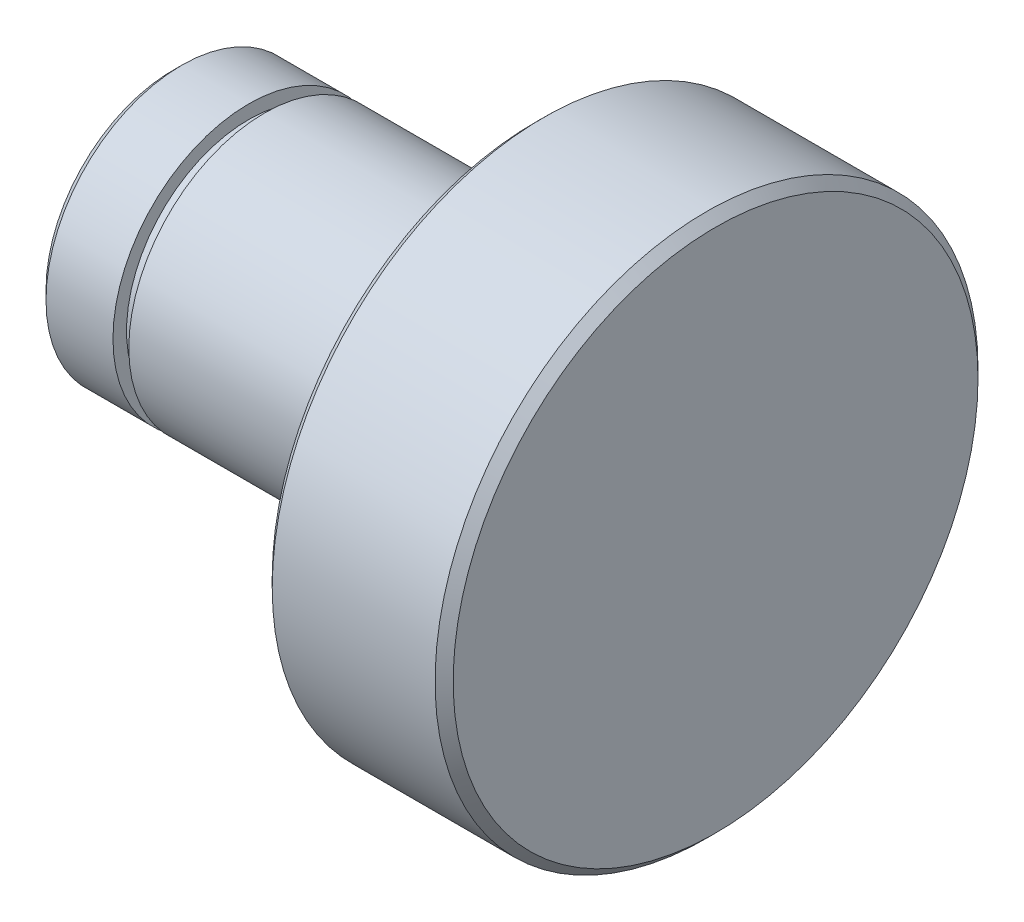
ISO-10303-21;
HEADER;
FILE_DESCRIPTION(('STEP AP214'),'2;1');
FILE_NAME('part.step','',(''),(''),'','','');
FILE_SCHEMA(('AUTOMOTIVE_DESIGN { 1 0 10303 214 1 1 1 1 }'));
ENDSEC;
DATA;
#1=APPLICATION_CONTEXT('core data for automotive mechanical design processes');
#2=APPLICATION_PROTOCOL_DEFINITION('international standard','automotive_design',2000,#1);
#3=PRODUCT_CONTEXT('',#1,'mechanical');
#4=PRODUCT('Part','Part','',(#3));
#5=PRODUCT_RELATED_PRODUCT_CATEGORY('part','',(#4));
#6=PRODUCT_DEFINITION_FORMATION('','',#4);
#7=PRODUCT_DEFINITION_CONTEXT('part definition',#1,'design');
#8=PRODUCT_DEFINITION('design','',#6,#7);
#9=PRODUCT_DEFINITION_SHAPE('','',#8);
#10=(LENGTH_UNIT() NAMED_UNIT(*) SI_UNIT(.MILLI.,.METRE.));
#11=(NAMED_UNIT(*) PLANE_ANGLE_UNIT() SI_UNIT($,.RADIAN.));
#12=(NAMED_UNIT(*) SI_UNIT($,.STERADIAN.) SOLID_ANGLE_UNIT());
#13=UNCERTAINTY_MEASURE_WITH_UNIT(LENGTH_MEASURE(1.E-05),#10,'distance_accuracy_value','');
#14=(GEOMETRIC_REPRESENTATION_CONTEXT(3) GLOBAL_UNCERTAINTY_ASSIGNED_CONTEXT((#13)) GLOBAL_UNIT_ASSIGNED_CONTEXT((#10,
#11,#12)) REPRESENTATION_CONTEXT('',''));
#15=CARTESIAN_POINT('',(0.,0.,0.));
#16=DIRECTION('',(0.,0.,1.));
#17=DIRECTION('',(1.,0.,0.));
#18=AXIS2_PLACEMENT_3D('',#15,#16,#17);
#19=CARTESIAN_POINT('',(0.,0.,0.));
#20=DIRECTION('',(1.,0.,0.));
#21=DIRECTION('',(0.,0.,-1.));
#22=AXIS2_PLACEMENT_3D('',#19,#20,#21);
#23=PLANE('',#22);
#24=CARTESIAN_POINT('',(0.,0.,0.));
#25=DIRECTION('',(1.,0.,0.));
#26=DIRECTION('',(0.,0.,-1.));
#27=AXIS2_PLACEMENT_3D('',#24,#25,#26);
#28=CIRCLE('',#27,29.);
#29=CARTESIAN_POINT('',(0.,0.,-29.));
#30=VERTEX_POINT('',#29);
#31=EDGE_CURVE('E79',#30,#30,#28,.T.);
#32=ORIENTED_EDGE('',*,*,#31,.T.);
#33=EDGE_LOOP('',(#32));
#34=FACE_BOUND('',#33,.T.);
#35=ADVANCED_FACE('F38',(#34),#23,.T.);
#36=CARTESIAN_POINT('',(0.,0.,0.));
#37=DIRECTION('',(1.,0.,0.));
#38=DIRECTION('',(0.,0.,-1.));
#39=AXIS2_PLACEMENT_3D('',#36,#37,#38);
#40=CYLINDRICAL_SURFACE('',#39,30.);
#41=CARTESIAN_POINT('',(-1.00000000000001,0.,0.));
#42=DIRECTION('',(1.,0.,0.));
#43=DIRECTION('',(0.,0.,-1.));
#44=AXIS2_PLACEMENT_3D('',#41,#42,#43);
#45=CIRCLE('',#44,30.);
#46=CARTESIAN_POINT('',(-1.00000000000001,0.,-30.));
#47=VERTEX_POINT('',#46);
#48=EDGE_CURVE('E87',#47,#47,#45,.F.);
#49=ORIENTED_EDGE('',*,*,#48,.T.);
#50=EDGE_LOOP('',(#49));
#51=FACE_BOUND('',#50,.T.);
#52=CARTESIAN_POINT('',(-19.,0.,0.));
#53=DIRECTION('',(-1.,0.,0.));
#54=DIRECTION('',(0.,0.,1.));
#55=AXIS2_PLACEMENT_3D('',#52,#53,#54);
#56=CIRCLE('',#55,30.);
#57=CARTESIAN_POINT('',(-19.,0.,30.));
#58=VERTEX_POINT('',#57);
#59=EDGE_CURVE('E83',#58,#58,#56,.F.);
#60=ORIENTED_EDGE('',*,*,#59,.T.);
#61=EDGE_LOOP('',(#60));
#62=FACE_BOUND('',#61,.T.);
#63=ADVANCED_FACE('F104',(#51,#62),#40,.T.);
#64=CARTESIAN_POINT('',(-20.,30.,0.));
#65=DIRECTION('',(-1.,0.,0.));
#66=DIRECTION('',(0.,0.,1.));
#67=AXIS2_PLACEMENT_3D('',#64,#65,#66);
#68=PLANE('',#67);
#69=CARTESIAN_POINT('',(-20.,0.,0.));
#70=DIRECTION('',(-1.,0.,0.));
#71=DIRECTION('',(0.,0.,1.));
#72=AXIS2_PLACEMENT_3D('',#69,#70,#71);
#73=CIRCLE('',#72,29.);
#74=CARTESIAN_POINT('',(-20.,0.,29.));
#75=VERTEX_POINT('',#74);
#76=EDGE_CURVE('E54',#75,#75,#73,.T.);
#77=ORIENTED_EDGE('',*,*,#76,.T.);
#78=EDGE_LOOP('',(#77));
#79=FACE_BOUND('',#78,.T.);
#80=CARTESIAN_POINT('',(-20.,0.,0.));
#81=DIRECTION('',(1.,0.,0.));
#82=DIRECTION('',(0.,0.,-1.));
#83=AXIS2_PLACEMENT_3D('',#80,#81,#82);
#84=CIRCLE('',#83,15.);
#85=CARTESIAN_POINT('',(-20.,0.,-15.));
#86=VERTEX_POINT('',#85);
#87=EDGE_CURVE('E66',#86,#86,#84,.T.);
#88=ORIENTED_EDGE('',*,*,#87,.T.);
#89=EDGE_LOOP('',(#88));
#90=FACE_BOUND('',#89,.T.);
#91=ADVANCED_FACE('F94',(#79,#90),#68,.T.);
#92=CARTESIAN_POINT('',(0.,0.,0.));
#93=DIRECTION('',(1.,0.,0.));
#94=DIRECTION('',(0.,0.,-1.));
#95=AXIS2_PLACEMENT_3D('',#92,#93,#94);
#96=CYLINDRICAL_SURFACE('',#95,15.);
#97=CARTESIAN_POINT('',(-49.85,0.,0.));
#98=DIRECTION('',(1.,0.,0.));
#99=DIRECTION('',(0.,0.,-1.));
#100=AXIS2_PLACEMENT_3D('',#97,#98,#99);
#101=CIRCLE('',#100,15.);
#102=CARTESIAN_POINT('',(-49.85,0.,-15.));
#103=VERTEX_POINT('',#102);
#104=EDGE_CURVE('E57',#103,#103,#101,.F.);
#105=ORIENTED_EDGE('',*,*,#104,.F.);
#106=EDGE_LOOP('',(#105));
#107=FACE_BOUND('',#106,.T.);
#108=ORIENTED_EDGE('',*,*,#87,.F.);
#109=EDGE_LOOP('',(#108));
#110=FACE_BOUND('',#109,.T.);
#111=ADVANCED_FACE('F112',(#107,#110),#96,.T.);
#112=CARTESIAN_POINT('',(0.,0.,0.));
#113=DIRECTION('',(-1.,0.,0.));
#114=DIRECTION('',(0.,0.,1.));
#115=AXIS2_PLACEMENT_3D('',#112,#113,#114);
#116=CONICAL_SURFACE('',#115,29.,0.785398163397453);
#117=ORIENTED_EDGE('',*,*,#48,.F.);
#118=EDGE_LOOP('',(#117));
#119=FACE_BOUND('',#118,.T.);
#120=ORIENTED_EDGE('',*,*,#31,.F.);
#121=EDGE_LOOP('',(#120));
#122=FACE_BOUND('',#121,.T.);
#123=ADVANCED_FACE('F101',(#119,#122),#116,.T.);
#124=CARTESIAN_POINT('',(-19.,0.,0.));
#125=DIRECTION('',(1.,0.,0.));
#126=DIRECTION('',(0.,0.,-1.));
#127=AXIS2_PLACEMENT_3D('',#124,#125,#126);
#128=CONICAL_SURFACE('',#127,30.,0.78539816339745);
#129=ORIENTED_EDGE('',*,*,#76,.F.);
#130=EDGE_LOOP('',(#129));
#131=FACE_BOUND('',#130,.T.);
#132=ORIENTED_EDGE('',*,*,#59,.F.);
#133=EDGE_LOOP('',(#132));
#134=FACE_BOUND('',#133,.T.);
#135=ADVANCED_FACE('F97',(#131,#134),#128,.T.);
#136=CARTESIAN_POINT('',(-51.6,0.,0.));
#137=DIRECTION('',(-1.,0.,0.));
#138=DIRECTION('',(0.,0.,1.));
#139=AXIS2_PLACEMENT_3D('',#136,#137,#138);
#140=PLANE('',#139);
#141=CARTESIAN_POINT('',(-51.6,0.,0.));
#142=DIRECTION('',(-1.,0.,0.));
#143=DIRECTION('',(0.,0.,1.));
#144=AXIS2_PLACEMENT_3D('',#141,#142,#143);
#145=CIRCLE('',#144,15.);
#146=CARTESIAN_POINT('',(-51.6,0.,15.));
#147=VERTEX_POINT('',#146);
#148=EDGE_CURVE('E43',#147,#147,#145,.F.);
#149=ORIENTED_EDGE('',*,*,#148,.T.);
#150=EDGE_LOOP('',(#149));
#151=FACE_BOUND('',#150,.T.);
#152=CARTESIAN_POINT('',(-51.6,0.,0.));
#153=DIRECTION('',(1.,0.,0.));
#154=DIRECTION('',(0.,0.,-1.));
#155=AXIS2_PLACEMENT_3D('',#152,#153,#154);
#156=CIRCLE('',#155,13.5);
#157=CARTESIAN_POINT('',(-51.6,0.,-13.5));
#158=VERTEX_POINT('',#157);
#159=EDGE_CURVE('E60',#158,#158,#156,.T.);
#160=ORIENTED_EDGE('',*,*,#159,.F.);
#161=EDGE_LOOP('',(#160));
#162=FACE_BOUND('',#161,.T.);
#163=ADVANCED_FACE('F100',(#151,#162),#140,.F.);
#164=CARTESIAN_POINT('',(0.,0.,0.));
#165=DIRECTION('',(1.,0.,0.));
#166=DIRECTION('',(0.,0.,-1.));
#167=AXIS2_PLACEMENT_3D('',#164,#165,#166);
#168=CYLINDRICAL_SURFACE('',#167,13.5);
#169=ORIENTED_EDGE('',*,*,#159,.T.);
#170=EDGE_LOOP('',(#169));
#171=FACE_BOUND('',#170,.T.);
#172=CARTESIAN_POINT('',(-49.85,0.,0.));
#173=DIRECTION('',(1.,0.,0.));
#174=DIRECTION('',(0.,0.,-1.));
#175=AXIS2_PLACEMENT_3D('',#172,#173,#174);
#176=CIRCLE('',#175,13.5);
#177=CARTESIAN_POINT('',(-49.85,0.,-13.5));
#178=VERTEX_POINT('',#177);
#179=EDGE_CURVE('E68',#178,#178,#176,.T.);
#180=ORIENTED_EDGE('',*,*,#179,.F.);
#181=EDGE_LOOP('',(#180));
#182=FACE_BOUND('',#181,.T.);
#183=ADVANCED_FACE('F158',(#171,#182),#168,.T.);
#184=CARTESIAN_POINT('',(-49.85,0.,0.));
#185=DIRECTION('',(1.,0.,0.));
#186=DIRECTION('',(0.,0.,-1.));
#187=AXIS2_PLACEMENT_3D('',#184,#185,#186);
#188=PLANE('',#187);
#189=ORIENTED_EDGE('',*,*,#104,.T.);
#190=EDGE_LOOP('',(#189));
#191=FACE_BOUND('',#190,.T.);
#192=ORIENTED_EDGE('',*,*,#179,.T.);
#193=EDGE_LOOP('',(#192));
#194=FACE_BOUND('',#193,.T.);
#195=ADVANCED_FACE('F163',(#191,#194),#188,.F.);
#196=CARTESIAN_POINT('',(-60.,15.,0.));
#197=DIRECTION('',(-1.,0.,0.));
#198=DIRECTION('',(0.,0.,1.));
#199=AXIS2_PLACEMENT_3D('',#196,#197,#198);
#200=PLANE('',#199);
#201=CARTESIAN_POINT('',(-60.,0.,0.));
#202=DIRECTION('',(-1.,0.,0.));
#203=DIRECTION('',(0.,0.,1.));
#204=AXIS2_PLACEMENT_3D('',#201,#202,#203);
#205=CIRCLE('',#204,14.);
#206=CARTESIAN_POINT('',(-60.,0.,14.));
#207=VERTEX_POINT('',#206);
#208=EDGE_CURVE('E10',#207,#207,#205,.T.);
#209=ORIENTED_EDGE('',*,*,#208,.T.);
#210=EDGE_LOOP('',(#209));
#211=FACE_BOUND('',#210,.T.);
#212=ADVANCED_FACE('F149',(#211),#200,.T.);
#213=CARTESIAN_POINT('',(-59.,0.,0.));
#214=DIRECTION('',(1.,0.,0.));
#215=DIRECTION('',(0.,0.,-1.));
#216=AXIS2_PLACEMENT_3D('',#213,#214,#215);
#217=CONICAL_SURFACE('',#216,15.,0.785398163397449);
#218=ORIENTED_EDGE('',*,*,#208,.F.);
#219=EDGE_LOOP('',(#218));
#220=FACE_BOUND('',#219,.T.);
#221=CARTESIAN_POINT('',(-59.,0.,0.));
#222=DIRECTION('',(-1.,0.,0.));
#223=DIRECTION('',(0.,0.,1.));
#224=AXIS2_PLACEMENT_3D('',#221,#222,#223);
#225=CIRCLE('',#224,15.);
#226=CARTESIAN_POINT('',(-59.,0.,15.));
#227=VERTEX_POINT('',#226);
#228=EDGE_CURVE('E48',#227,#227,#225,.F.);
#229=ORIENTED_EDGE('',*,*,#228,.F.);
#230=EDGE_LOOP('',(#229));
#231=FACE_BOUND('',#230,.T.);
#232=ADVANCED_FACE('F41',(#220,#231),#217,.T.);
#233=ORIENTED_EDGE('',*,*,#148,.F.);
#234=EDGE_LOOP('',(#233));
#235=FACE_BOUND('',#234,.T.);
#236=ORIENTED_EDGE('',*,*,#228,.T.);
#237=EDGE_LOOP('',(#236));
#238=FACE_BOUND('',#237,.T.);
#239=ADVANCED_FACE('F133',(#235,#238),#96,.T.);
#240=CLOSED_SHELL('',(#35,#63,#91,#111,#123,#135,#163,#183,#195,#212,#232,#239));
#241=MANIFOLD_SOLID_BREP('B2',#240);
#242=ADVANCED_BREP_SHAPE_REPRESENTATION('',(#18,#241),#14);
#243=SHAPE_DEFINITION_REPRESENTATION(#9,#242);
ENDSEC;
END-ISO-10303-21;
